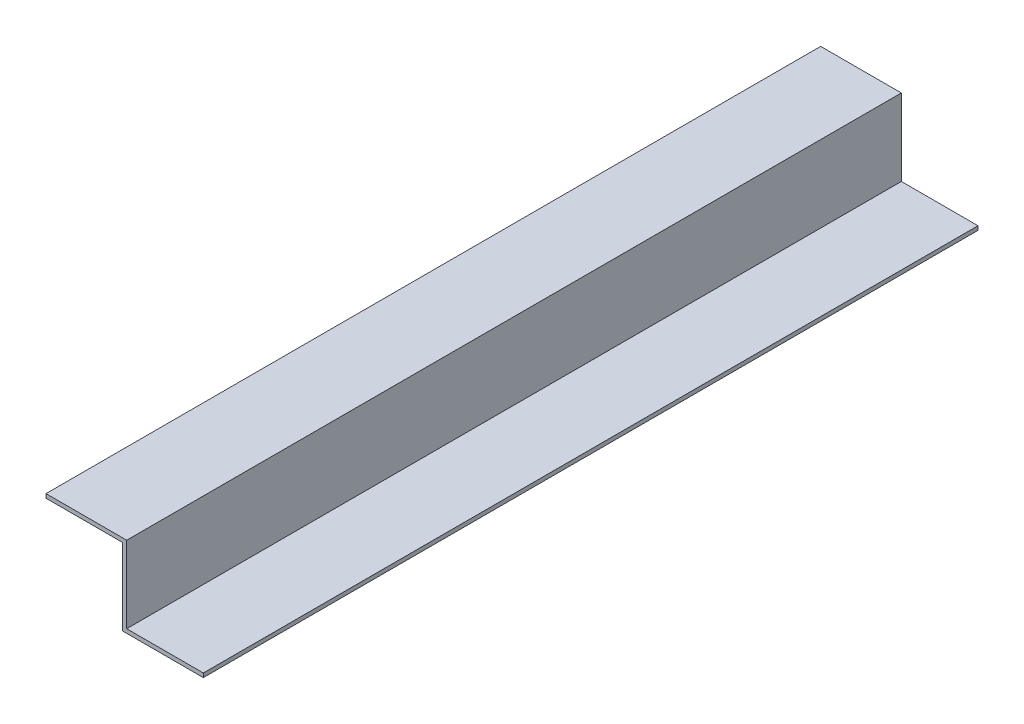
ISO-10303-21;
HEADER;
FILE_DESCRIPTION(('STEP AP214'),'2;1');
FILE_NAME('part.step','',(''),(''),'','','');
FILE_SCHEMA(('AUTOMOTIVE_DESIGN { 1 0 10303 214 1 1 1 1 }'));
ENDSEC;
DATA;
#1=APPLICATION_CONTEXT('core data for automotive mechanical design processes');
#2=APPLICATION_PROTOCOL_DEFINITION('international standard','automotive_design',2000,#1);
#3=PRODUCT_CONTEXT('',#1,'mechanical');
#4=PRODUCT('Part','Part','',(#3));
#5=PRODUCT_RELATED_PRODUCT_CATEGORY('part','',(#4));
#6=PRODUCT_DEFINITION_FORMATION('','',#4);
#7=PRODUCT_DEFINITION_CONTEXT('part definition',#1,'design');
#8=PRODUCT_DEFINITION('design','',#6,#7);
#9=PRODUCT_DEFINITION_SHAPE('','',#8);
#10=(LENGTH_UNIT() NAMED_UNIT(*) SI_UNIT(.MILLI.,.METRE.));
#11=(NAMED_UNIT(*) PLANE_ANGLE_UNIT() SI_UNIT($,.RADIAN.));
#12=(NAMED_UNIT(*) SI_UNIT($,.STERADIAN.) SOLID_ANGLE_UNIT());
#13=UNCERTAINTY_MEASURE_WITH_UNIT(LENGTH_MEASURE(1.E-05),#10,'distance_accuracy_value','');
#14=(GEOMETRIC_REPRESENTATION_CONTEXT(3) GLOBAL_UNCERTAINTY_ASSIGNED_CONTEXT((#13)) GLOBAL_UNIT_ASSIGNED_CONTEXT((#10,
#11,#12)) REPRESENTATION_CONTEXT('',''));
#15=CARTESIAN_POINT('',(0.,0.,0.));
#16=DIRECTION('',(0.,0.,1.));
#17=DIRECTION('',(1.,0.,0.));
#18=AXIS2_PLACEMENT_3D('',#15,#16,#17);
#19=CARTESIAN_POINT('',(0.79375,-14.2875,152.4));
#20=DIRECTION('',(0.,-1.,0.));
#21=DIRECTION('',(0.,0.,-1.));
#22=AXIS2_PLACEMENT_3D('',#19,#20,#21);
#23=PLANE('',#22);
#24=DIRECTION('',(0.,0.,-1.));
#25=VECTOR('',#24,1.);
#26=CARTESIAN_POINT('',(30.95625,-14.2875,152.4));
#27=LINE('',#26,#25);
#28=CARTESIAN_POINT('',(30.95625,-14.2875,152.4));
#29=VERTEX_POINT('',#28);
#30=CARTESIAN_POINT('',(30.95625,-14.2875,-152.4));
#31=VERTEX_POINT('',#30);
#32=EDGE_CURVE('E116',#29,#31,#27,.T.);
#33=ORIENTED_EDGE('',*,*,#32,.T.);
#34=DIRECTION('',(-1.,0.,0.));
#35=VECTOR('',#34,1.);
#36=CARTESIAN_POINT('',(0.79375,-14.2875,-152.4));
#37=LINE('',#36,#35);
#38=CARTESIAN_POINT('',(0.79375,-14.2875,-152.4));
#39=VERTEX_POINT('',#38);
#40=EDGE_CURVE('E110',#31,#39,#37,.T.);
#41=ORIENTED_EDGE('',*,*,#40,.T.);
#42=DIRECTION('',(0.,0.,-1.));
#43=VECTOR('',#42,1.);
#44=CARTESIAN_POINT('',(0.79375,-14.2875,152.4));
#45=LINE('',#44,#43);
#46=CARTESIAN_POINT('',(0.79375,-14.2875,152.4));
#47=VERTEX_POINT('',#46);
#48=EDGE_CURVE('E11',#47,#39,#45,.T.);
#49=ORIENTED_EDGE('',*,*,#48,.F.);
#50=DIRECTION('',(-1.,0.,0.));
#51=VECTOR('',#50,1.);
#52=CARTESIAN_POINT('',(0.79375,-14.2875,152.4));
#53=LINE('',#52,#51);
#54=EDGE_CURVE('E134',#29,#47,#53,.T.);
#55=ORIENTED_EDGE('',*,*,#54,.F.);
#56=EDGE_LOOP('',(#33,#41,#49,#55));
#57=FACE_BOUND('',#56,.T.);
#58=ADVANCED_FACE('F34',(#57),#23,.F.);
#59=CARTESIAN_POINT('',(0.79375,-14.2875,152.4));
#60=DIRECTION('',(-1.,0.,0.));
#61=DIRECTION('',(0.,0.,1.));
#62=AXIS2_PLACEMENT_3D('',#59,#60,#61);
#63=PLANE('',#62);
#64=ORIENTED_EDGE('',*,*,#48,.T.);
#65=DIRECTION('',(0.,1.,0.));
#66=VECTOR('',#65,1.);
#67=CARTESIAN_POINT('',(0.79375,-14.2875,-152.4));
#68=LINE('',#67,#66);
#69=CARTESIAN_POINT('',(0.79375,15.875,-152.4));
#70=VERTEX_POINT('',#69);
#71=EDGE_CURVE('E100',#39,#70,#68,.T.);
#72=ORIENTED_EDGE('',*,*,#71,.T.);
#73=DIRECTION('',(0.,0.,-1.));
#74=VECTOR('',#73,1.);
#75=CARTESIAN_POINT('',(0.79375,15.875,152.4));
#76=LINE('',#75,#74);
#77=CARTESIAN_POINT('',(0.79375,15.875,152.4));
#78=VERTEX_POINT('',#77);
#79=EDGE_CURVE('E41',#78,#70,#76,.T.);
#80=ORIENTED_EDGE('',*,*,#79,.F.);
#81=DIRECTION('',(0.,1.,0.));
#82=VECTOR('',#81,1.);
#83=CARTESIAN_POINT('',(0.79375,-14.2875,152.4));
#84=LINE('',#83,#82);
#85=EDGE_CURVE('E101',#47,#78,#84,.T.);
#86=ORIENTED_EDGE('',*,*,#85,.F.);
#87=EDGE_LOOP('',(#64,#72,#80,#86));
#88=FACE_BOUND('',#87,.T.);
#89=ADVANCED_FACE('F98',(#88),#63,.F.);
#90=CARTESIAN_POINT('',(0.79375,15.875,152.4));
#91=DIRECTION('',(0.,-1.,0.));
#92=DIRECTION('',(0.,0.,-1.));
#93=AXIS2_PLACEMENT_3D('',#90,#91,#92);
#94=PLANE('',#93);
#95=ORIENTED_EDGE('',*,*,#79,.T.);
#96=DIRECTION('',(-1.,0.,0.));
#97=VECTOR('',#96,1.);
#98=CARTESIAN_POINT('',(0.79375,15.875,-152.4));
#99=LINE('',#98,#97);
#100=CARTESIAN_POINT('',(-30.95625,15.875,-152.4));
#101=VERTEX_POINT('',#100);
#102=EDGE_CURVE('E114',#70,#101,#99,.T.);
#103=ORIENTED_EDGE('',*,*,#102,.T.);
#104=DIRECTION('',(0.,0.,-1.));
#105=VECTOR('',#104,1.);
#106=CARTESIAN_POINT('',(-30.95625,15.875,152.4));
#107=LINE('',#106,#105);
#108=CARTESIAN_POINT('',(-30.95625,15.875,152.4));
#109=VERTEX_POINT('',#108);
#110=EDGE_CURVE('E156',#109,#101,#107,.T.);
#111=ORIENTED_EDGE('',*,*,#110,.F.);
#112=DIRECTION('',(-1.,0.,0.));
#113=VECTOR('',#112,1.);
#114=CARTESIAN_POINT('',(0.79375,15.875,152.4));
#115=LINE('',#114,#113);
#116=EDGE_CURVE('E137',#78,#109,#115,.T.);
#117=ORIENTED_EDGE('',*,*,#116,.F.);
#118=EDGE_LOOP('',(#95,#103,#111,#117));
#119=FACE_BOUND('',#118,.T.);
#120=ADVANCED_FACE('F159',(#119),#94,.F.);
#121=CARTESIAN_POINT('',(-30.95625,15.875,152.4));
#122=DIRECTION('',(1.,0.,0.));
#123=DIRECTION('',(0.,0.,-1.));
#124=AXIS2_PLACEMENT_3D('',#121,#122,#123);
#125=PLANE('',#124);
#126=ORIENTED_EDGE('',*,*,#110,.T.);
#127=DIRECTION('',(0.,-1.,0.));
#128=VECTOR('',#127,1.);
#129=CARTESIAN_POINT('',(-30.95625,15.875,-152.4));
#130=LINE('',#129,#128);
#131=CARTESIAN_POINT('',(-30.95625,14.2875,-152.4));
#132=VERTEX_POINT('',#131);
#133=EDGE_CURVE('E120',#101,#132,#130,.T.);
#134=ORIENTED_EDGE('',*,*,#133,.T.);
#135=DIRECTION('',(0.,0.,-1.));
#136=VECTOR('',#135,1.);
#137=CARTESIAN_POINT('',(-30.95625,14.2875,152.4));
#138=LINE('',#137,#136);
#139=CARTESIAN_POINT('',(-30.95625,14.2875,152.4));
#140=VERTEX_POINT('',#139);
#141=EDGE_CURVE('E154',#140,#132,#138,.T.);
#142=ORIENTED_EDGE('',*,*,#141,.F.);
#143=DIRECTION('',(0.,-1.,0.));
#144=VECTOR('',#143,1.);
#145=CARTESIAN_POINT('',(-30.95625,15.875,152.4));
#146=LINE('',#145,#144);
#147=EDGE_CURVE('E139',#109,#140,#146,.T.);
#148=ORIENTED_EDGE('',*,*,#147,.F.);
#149=EDGE_LOOP('',(#126,#134,#142,#148));
#150=FACE_BOUND('',#149,.T.);
#151=ADVANCED_FACE('F167',(#150),#125,.F.);
#152=CARTESIAN_POINT('',(-0.79375,14.2875,152.4));
#153=DIRECTION('',(0.,1.,0.));
#154=DIRECTION('',(0.,0.,1.));
#155=AXIS2_PLACEMENT_3D('',#152,#153,#154);
#156=PLANE('',#155);
#157=ORIENTED_EDGE('',*,*,#141,.T.);
#158=DIRECTION('',(1.,0.,0.));
#159=VECTOR('',#158,1.);
#160=CARTESIAN_POINT('',(-0.79375,14.2875,-152.4));
#161=LINE('',#160,#159);
#162=CARTESIAN_POINT('',(-0.79375,14.2875,-152.4));
#163=VERTEX_POINT('',#162);
#164=EDGE_CURVE('E123',#132,#163,#161,.T.);
#165=ORIENTED_EDGE('',*,*,#164,.T.);
#166=DIRECTION('',(0.,0.,-1.));
#167=VECTOR('',#166,1.);
#168=CARTESIAN_POINT('',(-0.79375,14.2875,152.4));
#169=LINE('',#168,#167);
#170=CARTESIAN_POINT('',(-0.79375,14.2875,152.4));
#171=VERTEX_POINT('',#170);
#172=EDGE_CURVE('E152',#171,#163,#169,.T.);
#173=ORIENTED_EDGE('',*,*,#172,.F.);
#174=DIRECTION('',(1.,0.,0.));
#175=VECTOR('',#174,1.);
#176=CARTESIAN_POINT('',(-0.79375,14.2875,152.4));
#177=LINE('',#176,#175);
#178=EDGE_CURVE('E141',#140,#171,#177,.T.);
#179=ORIENTED_EDGE('',*,*,#178,.F.);
#180=EDGE_LOOP('',(#157,#165,#173,#179));
#181=FACE_BOUND('',#180,.T.);
#182=ADVANCED_FACE('F170',(#181),#156,.F.);
#183=CARTESIAN_POINT('',(-0.79375,-15.875,152.4));
#184=DIRECTION('',(1.,0.,0.));
#185=DIRECTION('',(0.,0.,-1.));
#186=AXIS2_PLACEMENT_3D('',#183,#184,#185);
#187=PLANE('',#186);
#188=ORIENTED_EDGE('',*,*,#172,.T.);
#189=DIRECTION('',(0.,-1.,0.));
#190=VECTOR('',#189,1.);
#191=CARTESIAN_POINT('',(-0.79375,-15.875,-152.4));
#192=LINE('',#191,#190);
#193=CARTESIAN_POINT('',(-0.79375,-15.875,-152.4));
#194=VERTEX_POINT('',#193);
#195=EDGE_CURVE('E126',#163,#194,#192,.T.);
#196=ORIENTED_EDGE('',*,*,#195,.T.);
#197=DIRECTION('',(0.,0.,-1.));
#198=VECTOR('',#197,1.);
#199=CARTESIAN_POINT('',(-0.79375,-15.875,152.4));
#200=LINE('',#199,#198);
#201=CARTESIAN_POINT('',(-0.79375,-15.875,152.4));
#202=VERTEX_POINT('',#201);
#203=EDGE_CURVE('E150',#202,#194,#200,.T.);
#204=ORIENTED_EDGE('',*,*,#203,.F.);
#205=DIRECTION('',(0.,-1.,0.));
#206=VECTOR('',#205,1.);
#207=CARTESIAN_POINT('',(-0.79375,-15.875,152.4));
#208=LINE('',#207,#206);
#209=EDGE_CURVE('E143',#171,#202,#208,.T.);
#210=ORIENTED_EDGE('',*,*,#209,.F.);
#211=EDGE_LOOP('',(#188,#196,#204,#210));
#212=FACE_BOUND('',#211,.T.);
#213=ADVANCED_FACE('F175',(#212),#187,.F.);
#214=CARTESIAN_POINT('',(-0.79375,-15.875,152.4));
#215=DIRECTION('',(0.,1.,0.));
#216=DIRECTION('',(0.,0.,1.));
#217=AXIS2_PLACEMENT_3D('',#214,#215,#216);
#218=PLANE('',#217);
#219=ORIENTED_EDGE('',*,*,#203,.T.);
#220=DIRECTION('',(1.,0.,0.));
#221=VECTOR('',#220,1.);
#222=CARTESIAN_POINT('',(-0.79375,-15.875,-152.4));
#223=LINE('',#222,#221);
#224=CARTESIAN_POINT('',(30.95625,-15.875,-152.4));
#225=VERTEX_POINT('',#224);
#226=EDGE_CURVE('E129',#194,#225,#223,.T.);
#227=ORIENTED_EDGE('',*,*,#226,.T.);
#228=DIRECTION('',(0.,0.,-1.));
#229=VECTOR('',#228,1.);
#230=CARTESIAN_POINT('',(30.95625,-15.875,152.4));
#231=LINE('',#230,#229);
#232=CARTESIAN_POINT('',(30.95625,-15.875,152.4));
#233=VERTEX_POINT('',#232);
#234=EDGE_CURVE('E148',#233,#225,#231,.T.);
#235=ORIENTED_EDGE('',*,*,#234,.F.);
#236=DIRECTION('',(1.,0.,0.));
#237=VECTOR('',#236,1.);
#238=CARTESIAN_POINT('',(-0.79375,-15.875,152.4));
#239=LINE('',#238,#237);
#240=EDGE_CURVE('E53',#202,#233,#239,.T.);
#241=ORIENTED_EDGE('',*,*,#240,.F.);
#242=EDGE_LOOP('',(#219,#227,#235,#241));
#243=FACE_BOUND('',#242,.T.);
#244=ADVANCED_FACE('F178',(#243),#218,.F.);
#245=CARTESIAN_POINT('',(30.95625,-14.2875,152.4));
#246=DIRECTION('',(-1.,0.,0.));
#247=DIRECTION('',(0.,0.,1.));
#248=AXIS2_PLACEMENT_3D('',#245,#246,#247);
#249=PLANE('',#248);
#250=ORIENTED_EDGE('',*,*,#234,.T.);
#251=DIRECTION('',(0.,1.,0.));
#252=VECTOR('',#251,1.);
#253=CARTESIAN_POINT('',(30.95625,-14.2875,-152.4));
#254=LINE('',#253,#252);
#255=EDGE_CURVE('E132',#225,#31,#254,.T.);
#256=ORIENTED_EDGE('',*,*,#255,.T.);
#257=ORIENTED_EDGE('',*,*,#32,.F.);
#258=DIRECTION('',(0.,1.,0.));
#259=VECTOR('',#258,1.);
#260=CARTESIAN_POINT('',(30.95625,-14.2875,152.4));
#261=LINE('',#260,#259);
#262=EDGE_CURVE('E48',#233,#29,#261,.T.);
#263=ORIENTED_EDGE('',*,*,#262,.F.);
#264=EDGE_LOOP('',(#250,#256,#257,#263));
#265=FACE_BOUND('',#264,.T.);
#266=ADVANCED_FACE('F180',(#265),#249,.F.);
#267=CARTESIAN_POINT('',(0.,0.,152.4));
#268=DIRECTION('',(0.,0.,-1.));
#269=DIRECTION('',(-1.,0.,0.));
#270=AXIS2_PLACEMENT_3D('',#267,#268,#269);
#271=PLANE('',#270);
#272=ORIENTED_EDGE('',*,*,#54,.T.);
#273=ORIENTED_EDGE('',*,*,#85,.T.);
#274=ORIENTED_EDGE('',*,*,#116,.T.);
#275=ORIENTED_EDGE('',*,*,#147,.T.);
#276=ORIENTED_EDGE('',*,*,#178,.T.);
#277=ORIENTED_EDGE('',*,*,#209,.T.);
#278=ORIENTED_EDGE('',*,*,#240,.T.);
#279=ORIENTED_EDGE('',*,*,#262,.T.);
#280=EDGE_LOOP('',(#272,#273,#274,#275,#276,#277,#278,#279));
#281=FACE_BOUND('',#280,.T.);
#282=ADVANCED_FACE('F162',(#281),#271,.F.);
#283=CARTESIAN_POINT('',(0.,0.,-152.4));
#284=DIRECTION('',(0.,0.,-1.));
#285=DIRECTION('',(-1.,0.,0.));
#286=AXIS2_PLACEMENT_3D('',#283,#284,#285);
#287=PLANE('',#286);
#288=ORIENTED_EDGE('',*,*,#40,.F.);
#289=ORIENTED_EDGE('',*,*,#255,.F.);
#290=ORIENTED_EDGE('',*,*,#226,.F.);
#291=ORIENTED_EDGE('',*,*,#195,.F.);
#292=ORIENTED_EDGE('',*,*,#164,.F.);
#293=ORIENTED_EDGE('',*,*,#133,.F.);
#294=ORIENTED_EDGE('',*,*,#102,.F.);
#295=ORIENTED_EDGE('',*,*,#71,.F.);
#296=EDGE_LOOP('',(#288,#289,#290,#291,#292,#293,#294,#295));
#297=FACE_BOUND('',#296,.T.);
#298=ADVANCED_FACE('F108',(#297),#287,.T.);
#299=CLOSED_SHELL('',(#58,#89,#120,#151,#182,#213,#244,#266,#282,#298));
#300=MANIFOLD_SOLID_BREP('B2',#299);
#301=ADVANCED_BREP_SHAPE_REPRESENTATION('',(#18,#300),#14);
#302=SHAPE_DEFINITION_REPRESENTATION(#9,#301);
ENDSEC;
END-ISO-10303-21;
